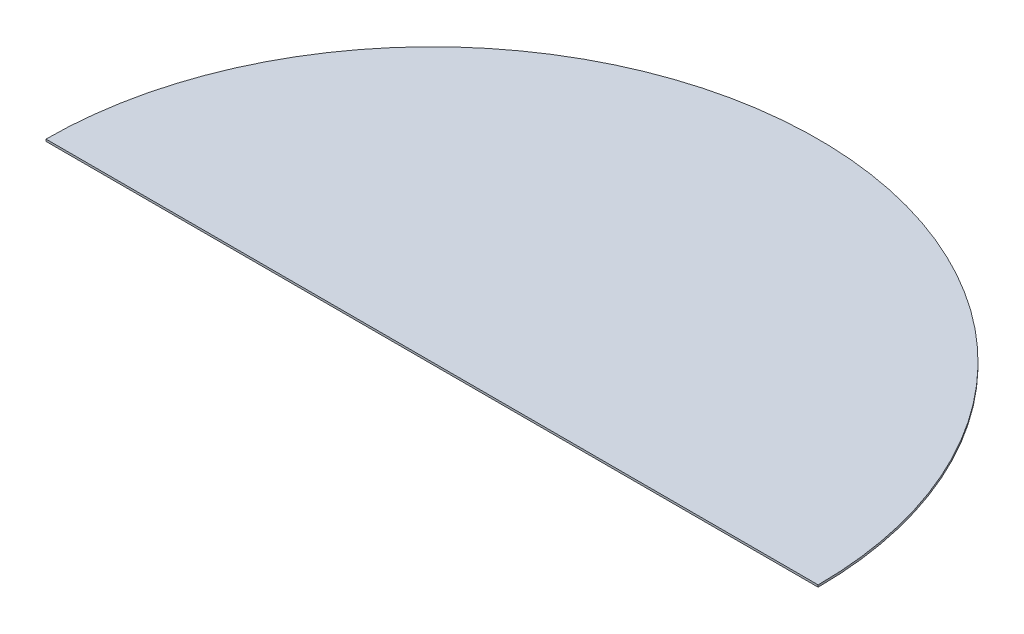
ISO-10303-21;
HEADER;
FILE_DESCRIPTION(('STEP AP214'),'2;1');
FILE_NAME('part.step','',(''),(''),'','','');
FILE_SCHEMA(('AUTOMOTIVE_DESIGN { 1 0 10303 214 1 1 1 1 }'));
ENDSEC;
DATA;
#1=APPLICATION_CONTEXT('core data for automotive mechanical design processes');
#2=APPLICATION_PROTOCOL_DEFINITION('international standard','automotive_design',2000,#1);
#3=PRODUCT_CONTEXT('',#1,'mechanical');
#4=PRODUCT('Part','Part','',(#3));
#5=PRODUCT_RELATED_PRODUCT_CATEGORY('part','',(#4));
#6=PRODUCT_DEFINITION_FORMATION('','',#4);
#7=PRODUCT_DEFINITION_CONTEXT('part definition',#1,'design');
#8=PRODUCT_DEFINITION('design','',#6,#7);
#9=PRODUCT_DEFINITION_SHAPE('','',#8);
#10=(LENGTH_UNIT() NAMED_UNIT(*) SI_UNIT(.MILLI.,.METRE.));
#11=(NAMED_UNIT(*) PLANE_ANGLE_UNIT() SI_UNIT($,.RADIAN.));
#12=(NAMED_UNIT(*) SI_UNIT($,.STERADIAN.) SOLID_ANGLE_UNIT());
#13=UNCERTAINTY_MEASURE_WITH_UNIT(LENGTH_MEASURE(1.E-05),#10,'distance_accuracy_value','');
#14=(GEOMETRIC_REPRESENTATION_CONTEXT(3) GLOBAL_UNCERTAINTY_ASSIGNED_CONTEXT((#13)) GLOBAL_UNIT_ASSIGNED_CONTEXT((#10,
#11,#12)) REPRESENTATION_CONTEXT('',''));
#15=CARTESIAN_POINT('',(0.,0.,0.));
#16=DIRECTION('',(0.,0.,1.));
#17=DIRECTION('',(1.,0.,0.));
#18=AXIS2_PLACEMENT_3D('',#15,#16,#17);
#19=CARTESIAN_POINT('',(0.,3.175,0.));
#20=DIRECTION('',(0.,-1.,0.));
#21=DIRECTION('',(0.,0.,-1.));
#22=AXIS2_PLACEMENT_3D('',#19,#20,#21);
#23=CYLINDRICAL_SURFACE('',#22,600.);
#24=CARTESIAN_POINT('',(0.,0.,0.));
#25=DIRECTION('',(0.,1.,0.));
#26=DIRECTION('',(0.,0.,1.));
#27=AXIS2_PLACEMENT_3D('',#24,#25,#26);
#28=CIRCLE('',#27,600.);
#29=CARTESIAN_POINT('',(600.,0.,0.));
#30=VERTEX_POINT('',#29);
#31=CARTESIAN_POINT('',(-600.,0.,0.));
#32=VERTEX_POINT('',#31);
#33=EDGE_CURVE('E72',#30,#32,#28,.T.);
#34=ORIENTED_EDGE('',*,*,#33,.T.);
#35=DIRECTION('',(0.,-1.,0.));
#36=VECTOR('',#35,1.);
#37=CARTESIAN_POINT('',(-600.,3.175,0.));
#38=LINE('',#37,#36);
#39=CARTESIAN_POINT('',(-600.,3.175,0.));
#40=VERTEX_POINT('',#39);
#41=EDGE_CURVE('E11',#40,#32,#38,.T.);
#42=ORIENTED_EDGE('',*,*,#41,.F.);
#43=CARTESIAN_POINT('',(0.,3.175,0.));
#44=DIRECTION('',(0.,1.,0.));
#45=DIRECTION('',(0.,0.,1.));
#46=AXIS2_PLACEMENT_3D('',#43,#44,#45);
#47=CIRCLE('',#46,600.);
#48=CARTESIAN_POINT('',(600.,3.175,0.));
#49=VERTEX_POINT('',#48);
#50=EDGE_CURVE('E71',#49,#40,#47,.T.);
#51=ORIENTED_EDGE('',*,*,#50,.F.);
#52=DIRECTION('',(0.,-1.,0.));
#53=VECTOR('',#52,1.);
#54=CARTESIAN_POINT('',(600.,3.175,0.));
#55=LINE('',#54,#53);
#56=EDGE_CURVE('E48',#49,#30,#55,.T.);
#57=ORIENTED_EDGE('',*,*,#56,.T.);
#58=EDGE_LOOP('',(#34,#42,#51,#57));
#59=FACE_BOUND('',#58,.T.);
#60=ADVANCED_FACE('F39',(#59),#23,.T.);
#61=CARTESIAN_POINT('',(-600.,3.175,0.));
#62=DIRECTION('',(0.,0.,-1.));
#63=DIRECTION('',(-1.,0.,0.));
#64=AXIS2_PLACEMENT_3D('',#61,#62,#63);
#65=PLANE('',#64);
#66=DIRECTION('',(1.,0.,0.));
#67=VECTOR('',#66,1.);
#68=CARTESIAN_POINT('',(-600.,0.,0.));
#69=LINE('',#68,#67);
#70=EDGE_CURVE('E63',#32,#30,#69,.T.);
#71=ORIENTED_EDGE('',*,*,#70,.T.);
#72=ORIENTED_EDGE('',*,*,#56,.F.);
#73=DIRECTION('',(1.,0.,0.));
#74=VECTOR('',#73,1.);
#75=CARTESIAN_POINT('',(-600.,3.175,0.));
#76=LINE('',#75,#74);
#77=EDGE_CURVE('E55',#40,#49,#76,.T.);
#78=ORIENTED_EDGE('',*,*,#77,.F.);
#79=ORIENTED_EDGE('',*,*,#41,.T.);
#80=EDGE_LOOP('',(#71,#72,#78,#79));
#81=FACE_BOUND('',#80,.T.);
#82=ADVANCED_FACE('F66',(#81),#65,.F.);
#83=CARTESIAN_POINT('',(0.,3.175,0.));
#84=DIRECTION('',(0.,1.,0.));
#85=DIRECTION('',(0.,0.,1.));
#86=AXIS2_PLACEMENT_3D('',#83,#84,#85);
#87=PLANE('',#86);
#88=ORIENTED_EDGE('',*,*,#50,.T.);
#89=ORIENTED_EDGE('',*,*,#77,.T.);
#90=EDGE_LOOP('',(#88,#89));
#91=FACE_BOUND('',#90,.T.);
#92=ADVANCED_FACE('F83',(#91),#87,.T.);
#93=CARTESIAN_POINT('',(0.,0.,0.));
#94=DIRECTION('',(0.,1.,0.));
#95=DIRECTION('',(0.,0.,1.));
#96=AXIS2_PLACEMENT_3D('',#93,#94,#95);
#97=PLANE('',#96);
#98=ORIENTED_EDGE('',*,*,#33,.F.);
#99=ORIENTED_EDGE('',*,*,#70,.F.);
#100=EDGE_LOOP('',(#98,#99));
#101=FACE_BOUND('',#100,.T.);
#102=ADVANCED_FACE('F76',(#101),#97,.F.);
#103=CLOSED_SHELL('',(#60,#82,#92,#102));
#104=MANIFOLD_SOLID_BREP('B2',#103);
#105=ADVANCED_BREP_SHAPE_REPRESENTATION('',(#18,#104),#14);
#106=SHAPE_DEFINITION_REPRESENTATION(#9,#105);
ENDSEC;
END-ISO-10303-21;
